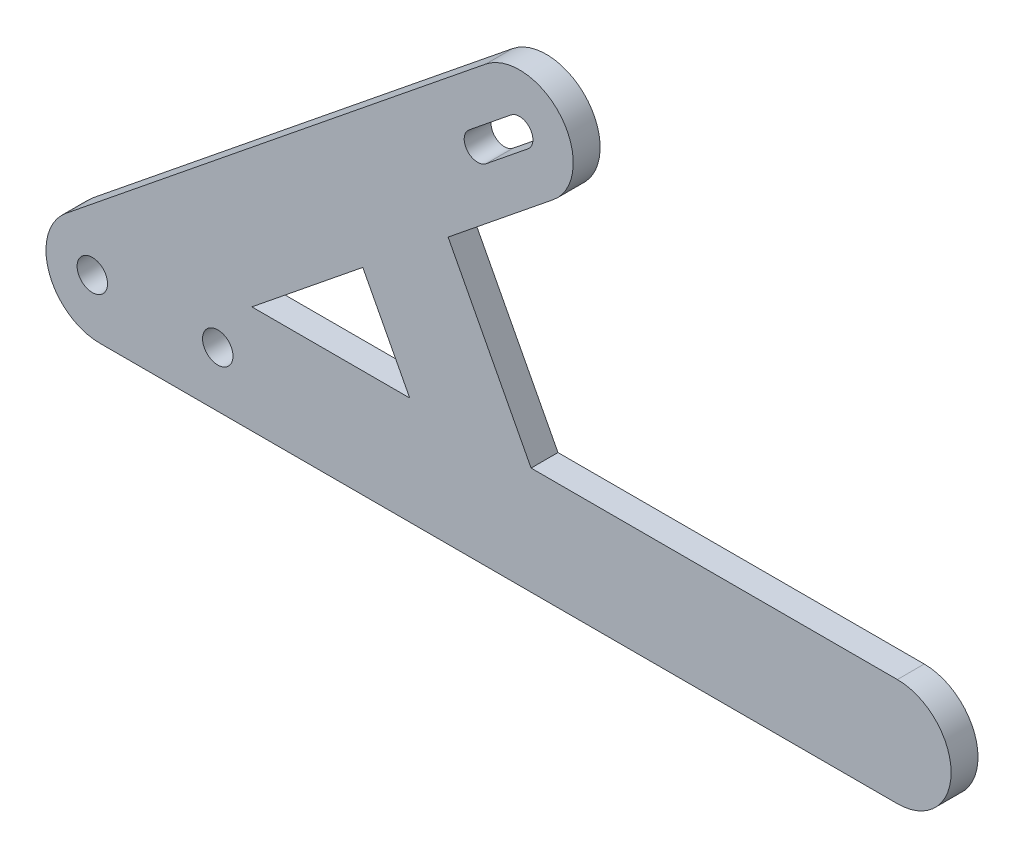
ISO-10303-21;
HEADER;
FILE_DESCRIPTION(('STEP AP214'),'2;1');
FILE_NAME('part.step','',(''),(''),'','','');
FILE_SCHEMA(('AUTOMOTIVE_DESIGN { 1 0 10303 214 1 1 1 1 }'));
ENDSEC;
DATA;
#1=APPLICATION_CONTEXT('core data for automotive mechanical design processes');
#2=APPLICATION_PROTOCOL_DEFINITION('international standard','automotive_design',2000,#1);
#3=PRODUCT_CONTEXT('',#1,'mechanical');
#4=PRODUCT('Part','Part','',(#3));
#5=PRODUCT_RELATED_PRODUCT_CATEGORY('part','',(#4));
#6=PRODUCT_DEFINITION_FORMATION('','',#4);
#7=PRODUCT_DEFINITION_CONTEXT('part definition',#1,'design');
#8=PRODUCT_DEFINITION('design','',#6,#7);
#9=PRODUCT_DEFINITION_SHAPE('','',#8);
#10=(LENGTH_UNIT() NAMED_UNIT(*) SI_UNIT(.MILLI.,.METRE.));
#11=(NAMED_UNIT(*) PLANE_ANGLE_UNIT() SI_UNIT($,.RADIAN.));
#12=(NAMED_UNIT(*) SI_UNIT($,.STERADIAN.) SOLID_ANGLE_UNIT());
#13=UNCERTAINTY_MEASURE_WITH_UNIT(LENGTH_MEASURE(1.E-05),#10,'distance_accuracy_value','');
#14=(GEOMETRIC_REPRESENTATION_CONTEXT(3) GLOBAL_UNCERTAINTY_ASSIGNED_CONTEXT((#13)) GLOBAL_UNIT_ASSIGNED_CONTEXT((#10,
#11,#12)) REPRESENTATION_CONTEXT('',''));
#15=CARTESIAN_POINT('',(0.,0.,0.));
#16=DIRECTION('',(0.,0.,1.));
#17=DIRECTION('',(1.,0.,0.));
#18=AXIS2_PLACEMENT_3D('',#15,#16,#17);
#19=CARTESIAN_POINT('',(-60.3098434553915,-20.4864568832613,3.));
#20=DIRECTION('',(-0.628440545433317,0.777857622483366,0.));
#21=DIRECTION('',(-0.777857622483366,-0.628440545433317,0.));
#22=AXIS2_PLACEMENT_3D('',#19,#20,#21);
#23=PLANE('',#22);
#24=DIRECTION('',(0.777857622483366,0.628440545433317,0.));
#25=VECTOR('',#24,1.);
#26=CARTESIAN_POINT('',(-60.3098434553915,-20.4864568832613,0.));
#27=LINE('',#26,#25);
#28=CARTESIAN_POINT('',(-5.62687624401837,23.6925711894018,0.));
#29=VERTEX_POINT('',#28);
#30=CARTESIAN_POINT('',(6.10421614004999,33.170262071746,0.));
#31=VERTEX_POINT('',#30);
#32=EDGE_CURVE('E195',#29,#31,#27,.T.);
#33=ORIENTED_EDGE('',*,*,#32,.T.);
#34=DIRECTION('',(0.,0.,-1.));
#35=VECTOR('',#34,1.);
#36=CARTESIAN_POINT('',(6.10421614004999,33.170262071746,3.));
#37=LINE('',#36,#35);
#38=CARTESIAN_POINT('',(6.10421614004999,33.170262071746,3.));
#39=VERTEX_POINT('',#38);
#40=EDGE_CURVE('E11',#39,#31,#37,.T.);
#41=ORIENTED_EDGE('',*,*,#40,.F.);
#42=DIRECTION('',(0.777857622483366,0.628440545433317,0.));
#43=VECTOR('',#42,1.);
#44=CARTESIAN_POINT('',(-60.3098434553915,-20.4864568832613,3.));
#45=LINE('',#44,#43);
#46=CARTESIAN_POINT('',(-5.62687624401837,23.6925711894018,3.));
#47=VERTEX_POINT('',#46);
#48=EDGE_CURVE('E263',#47,#39,#45,.T.);
#49=ORIENTED_EDGE('',*,*,#48,.F.);
#50=DIRECTION('',(0.,0.,-1.));
#51=VECTOR('',#50,1.);
#52=CARTESIAN_POINT('',(-5.62687624401837,23.6925711894018,3.));
#53=LINE('',#52,#51);
#54=EDGE_CURVE('E213',#47,#29,#53,.T.);
#55=ORIENTED_EDGE('',*,*,#54,.T.);
#56=EDGE_LOOP('',(#33,#41,#49,#55));
#57=FACE_BOUND('',#56,.T.);
#58=ADVANCED_FACE('F31',(#57),#23,.F.);
#59=CARTESIAN_POINT('',(2.3335728674501,37.8374078066462,3.));
#60=DIRECTION('',(0.,0.,-1.));
#61=DIRECTION('',(-1.,0.,0.));
#62=AXIS2_PLACEMENT_3D('',#59,#60,#61);
#63=CYLINDRICAL_SURFACE('',#62,6.);
#64=CARTESIAN_POINT('',(2.3335728674501,37.8374078066462,0.));
#65=DIRECTION('',(0.,0.,1.));
#66=DIRECTION('',(1.,0.,0.));
#67=AXIS2_PLACEMENT_3D('',#64,#65,#66);
#68=CIRCLE('',#67,6.);
#69=CARTESIAN_POINT('',(-1.43707040514982,42.5045535415464,0.));
#70=VERTEX_POINT('',#69);
#71=EDGE_CURVE('E198',#31,#70,#68,.T.);
#72=ORIENTED_EDGE('',*,*,#71,.T.);
#73=DIRECTION('',(0.,0.,-1.));
#74=VECTOR('',#73,1.);
#75=CARTESIAN_POINT('',(-1.43707040514982,42.5045535415464,3.));
#76=LINE('',#75,#74);
#77=CARTESIAN_POINT('',(-1.43707040514982,42.5045535415464,3.));
#78=VERTEX_POINT('',#77);
#79=EDGE_CURVE('E41',#78,#70,#76,.T.);
#80=ORIENTED_EDGE('',*,*,#79,.F.);
#81=CARTESIAN_POINT('',(2.3335728674501,37.8374078066462,3.));
#82=DIRECTION('',(0.,0.,1.));
#83=DIRECTION('',(1.,0.,0.));
#84=AXIS2_PLACEMENT_3D('',#81,#82,#83);
#85=CIRCLE('',#84,6.);
#86=EDGE_CURVE('E265',#39,#78,#85,.T.);
#87=ORIENTED_EDGE('',*,*,#86,.F.);
#88=ORIENTED_EDGE('',*,*,#40,.T.);
#89=EDGE_LOOP('',(#72,#80,#87,#88));
#90=FACE_BOUND('',#89,.T.);
#91=ADVANCED_FACE('F303',(#90),#63,.T.);
#92=CARTESIAN_POINT('',(-67.8511300005913,-11.1521654134609,3.));
#93=DIRECTION('',(-0.628440545433317,0.777857622483366,0.));
#94=DIRECTION('',(-0.777857622483366,-0.628440545433317,0.));
#95=AXIS2_PLACEMENT_3D('',#92,#93,#94);
#96=PLANE('',#95);
#97=DIRECTION('',(0.777857622483366,0.628440545433317,0.));
#98=VECTOR('',#97,1.);
#99=CARTESIAN_POINT('',(-67.8511300005913,-11.1521654134609,0.));
#100=LINE('',#99,#98);
#101=CARTESIAN_POINT('',(-48.2706432725999,4.66714573490019,0.));
#102=VERTEX_POINT('',#101);
#103=EDGE_CURVE('E201',#102,#70,#100,.T.);
#104=ORIENTED_EDGE('',*,*,#103,.F.);
#105=DIRECTION('',(0.,0.,-1.));
#106=VECTOR('',#105,1.);
#107=CARTESIAN_POINT('',(-48.2706432725999,4.66714573490019,3.));
#108=LINE('',#107,#106);
#109=CARTESIAN_POINT('',(-48.2706432725999,4.66714573490019,3.));
#110=VERTEX_POINT('',#109);
#111=EDGE_CURVE('E221',#110,#102,#108,.T.);
#112=ORIENTED_EDGE('',*,*,#111,.F.);
#113=DIRECTION('',(0.777857622483366,0.628440545433317,0.));
#114=VECTOR('',#113,1.);
#115=CARTESIAN_POINT('',(-67.8511300005913,-11.1521654134609,3.));
#116=LINE('',#115,#114);
#117=EDGE_CURVE('E267',#110,#78,#116,.T.);
#118=ORIENTED_EDGE('',*,*,#117,.T.);
#119=ORIENTED_EDGE('',*,*,#79,.T.);
#120=EDGE_LOOP('',(#104,#112,#118,#119));
#121=FACE_BOUND('',#120,.T.);
#122=ADVANCED_FACE('F308',(#121),#96,.T.);
#123=CARTESIAN_POINT('',(-44.5,0.,3.));
#124=DIRECTION('',(0.,0.,-1.));
#125=DIRECTION('',(-1.,0.,0.));
#126=AXIS2_PLACEMENT_3D('',#123,#124,#125);
#127=CYLINDRICAL_SURFACE('',#126,6.);
#128=CARTESIAN_POINT('',(-44.5,0.,0.));
#129=DIRECTION('',(0.,0.,1.));
#130=DIRECTION('',(1.,0.,0.));
#131=AXIS2_PLACEMENT_3D('',#128,#129,#130);
#132=CIRCLE('',#131,6.);
#133=CARTESIAN_POINT('',(-44.5,-6.00000000000001,0.));
#134=VERTEX_POINT('',#133);
#135=EDGE_CURVE('E204',#102,#134,#132,.T.);
#136=ORIENTED_EDGE('',*,*,#135,.T.);
#137=DIRECTION('',(0.,0.,-1.));
#138=VECTOR('',#137,1.);
#139=CARTESIAN_POINT('',(-44.5,-6.00000000000001,3.));
#140=LINE('',#139,#138);
#141=CARTESIAN_POINT('',(-44.5,-6.00000000000001,3.));
#142=VERTEX_POINT('',#141);
#143=EDGE_CURVE('E218',#142,#134,#140,.T.);
#144=ORIENTED_EDGE('',*,*,#143,.F.);
#145=CARTESIAN_POINT('',(-44.5,0.,3.));
#146=DIRECTION('',(0.,0.,1.));
#147=DIRECTION('',(1.,0.,0.));
#148=AXIS2_PLACEMENT_3D('',#145,#146,#147);
#149=CIRCLE('',#148,6.);
#150=EDGE_CURVE('E270',#110,#142,#149,.T.);
#151=ORIENTED_EDGE('',*,*,#150,.F.);
#152=ORIENTED_EDGE('',*,*,#111,.T.);
#153=EDGE_LOOP('',(#136,#144,#151,#152));
#154=FACE_BOUND('',#153,.T.);
#155=ADVANCED_FACE('F275',(#154),#127,.T.);
#156=CARTESIAN_POINT('',(-4.93689862327537,-6.00000000000001,3.));
#157=DIRECTION('',(0.,1.,0.));
#158=DIRECTION('',(0.,0.,1.));
#159=AXIS2_PLACEMENT_3D('',#156,#157,#158);
#160=PLANE('',#159);
#161=DIRECTION('',(1.,0.,0.));
#162=VECTOR('',#161,1.);
#163=CARTESIAN_POINT('',(-4.93689862327537,-6.00000000000001,0.));
#164=LINE('',#163,#162);
#165=CARTESIAN_POINT('',(44.5,-6.00000000000001,0.));
#166=VERTEX_POINT('',#165);
#167=EDGE_CURVE('E206',#134,#166,#164,.T.);
#168=ORIENTED_EDGE('',*,*,#167,.T.);
#169=DIRECTION('',(0.,0.,-1.));
#170=VECTOR('',#169,1.);
#171=CARTESIAN_POINT('',(44.5,-6.00000000000001,3.));
#172=LINE('',#171,#170);
#173=CARTESIAN_POINT('',(44.5,-6.00000000000001,3.));
#174=VERTEX_POINT('',#173);
#175=EDGE_CURVE('E165',#174,#166,#172,.T.);
#176=ORIENTED_EDGE('',*,*,#175,.F.);
#177=DIRECTION('',(1.,0.,0.));
#178=VECTOR('',#177,1.);
#179=CARTESIAN_POINT('',(-4.93689862327537,-6.00000000000001,3.));
#180=LINE('',#179,#178);
#181=EDGE_CURVE('E152',#142,#174,#180,.T.);
#182=ORIENTED_EDGE('',*,*,#181,.F.);
#183=ORIENTED_EDGE('',*,*,#143,.T.);
#184=EDGE_LOOP('',(#168,#176,#182,#183));
#185=FACE_BOUND('',#184,.T.);
#186=ADVANCED_FACE('F279',(#185),#160,.F.);
#187=CARTESIAN_POINT('',(44.5,0.,3.));
#188=DIRECTION('',(0.,0.,-1.));
#189=DIRECTION('',(-1.,0.,0.));
#190=AXIS2_PLACEMENT_3D('',#187,#188,#189);
#191=CYLINDRICAL_SURFACE('',#190,6.);
#192=CARTESIAN_POINT('',(44.5,0.,0.));
#193=DIRECTION('',(0.,0.,1.));
#194=DIRECTION('',(1.,0.,0.));
#195=AXIS2_PLACEMENT_3D('',#192,#193,#194);
#196=CIRCLE('',#195,6.);
#197=CARTESIAN_POINT('',(44.5,6.00000000000001,0.));
#198=VERTEX_POINT('',#197);
#199=EDGE_CURVE('E161',#166,#198,#196,.T.);
#200=ORIENTED_EDGE('',*,*,#199,.T.);
#201=DIRECTION('',(0.,0.,-1.));
#202=VECTOR('',#201,1.);
#203=CARTESIAN_POINT('',(44.5,6.00000000000001,3.));
#204=LINE('',#203,#202);
#205=CARTESIAN_POINT('',(44.5,6.00000000000001,3.));
#206=VERTEX_POINT('',#205);
#207=EDGE_CURVE('E158',#206,#198,#204,.T.);
#208=ORIENTED_EDGE('',*,*,#207,.F.);
#209=CARTESIAN_POINT('',(44.5,0.,3.));
#210=DIRECTION('',(0.,0.,1.));
#211=DIRECTION('',(1.,0.,0.));
#212=AXIS2_PLACEMENT_3D('',#209,#210,#211);
#213=CIRCLE('',#212,6.);
#214=EDGE_CURVE('E146',#174,#206,#213,.T.);
#215=ORIENTED_EDGE('',*,*,#214,.F.);
#216=ORIENTED_EDGE('',*,*,#175,.T.);
#217=EDGE_LOOP('',(#200,#208,#215,#216));
#218=FACE_BOUND('',#217,.T.);
#219=ADVANCED_FACE('F159',(#218),#191,.T.);
#220=CARTESIAN_POINT('',(-4.93689862327537,6.00000000000001,3.));
#221=DIRECTION('',(0.,1.,0.));
#222=DIRECTION('',(0.,0.,1.));
#223=AXIS2_PLACEMENT_3D('',#220,#221,#222);
#224=PLANE('',#223);
#225=DIRECTION('',(1.,0.,0.));
#226=VECTOR('',#225,1.);
#227=CARTESIAN_POINT('',(-4.93689862327537,6.00000000000001,0.));
#228=LINE('',#227,#226);
#229=CARTESIAN_POINT('',(3.63201233146094,6.00000000000002,0.));
#230=VERTEX_POINT('',#229);
#231=EDGE_CURVE('E209',#230,#198,#228,.T.);
#232=ORIENTED_EDGE('',*,*,#231,.F.);
#233=DIRECTION('',(0.,0.,-1.));
#234=VECTOR('',#233,1.);
#235=CARTESIAN_POINT('',(3.63201233146094,6.00000000000002,3.));
#236=LINE('',#235,#234);
#237=CARTESIAN_POINT('',(3.63201233146094,6.00000000000002,3.));
#238=VERTEX_POINT('',#237);
#239=EDGE_CURVE('E99',#238,#230,#236,.T.);
#240=ORIENTED_EDGE('',*,*,#239,.F.);
#241=DIRECTION('',(1.,0.,0.));
#242=VECTOR('',#241,1.);
#243=CARTESIAN_POINT('',(-4.93689862327537,6.00000000000001,3.));
#244=LINE('',#243,#242);
#245=EDGE_CURVE('E150',#238,#206,#244,.T.);
#246=ORIENTED_EDGE('',*,*,#245,.T.);
#247=ORIENTED_EDGE('',*,*,#207,.T.);
#248=EDGE_LOOP('',(#232,#240,#246,#247));
#249=FACE_BOUND('',#248,.T.);
#250=ADVANCED_FACE('F167',(#249),#224,.T.);
#251=CARTESIAN_POINT('',(-2.33357286745009,34.0667645340463,3.));
#252=DIRECTION('',(0.,0.,-1.));
#253=DIRECTION('',(-1.,0.,0.));
#254=AXIS2_PLACEMENT_3D('',#251,#252,#253);
#255=CYLINDRICAL_SURFACE('',#254,1.5);
#256=CARTESIAN_POINT('',(-2.33357286745009,34.0667645340463,0.));
#257=DIRECTION('',(0.,0.,1.));
#258=DIRECTION('',(1.,0.,0.));
#259=AXIS2_PLACEMENT_3D('',#256,#257,#258);
#260=CIRCLE('',#259,1.5);
#261=CARTESIAN_POINT('',(-3.27623368560007,35.2335509677713,0.));
#262=VERTEX_POINT('',#261);
#263=CARTESIAN_POINT('',(-1.39091204930011,32.8999781003212,0.));
#264=VERTEX_POINT('',#263);
#265=EDGE_CURVE('E183',#262,#264,#260,.T.);
#266=ORIENTED_EDGE('',*,*,#265,.F.);
#267=DIRECTION('',(0.,0.,-1.));
#268=VECTOR('',#267,1.);
#269=CARTESIAN_POINT('',(-3.27623368560007,35.2335509677713,3.));
#270=LINE('',#269,#268);
#271=CARTESIAN_POINT('',(-3.27623368560007,35.2335509677713,3.));
#272=VERTEX_POINT('',#271);
#273=EDGE_CURVE('E215',#272,#262,#270,.T.);
#274=ORIENTED_EDGE('',*,*,#273,.F.);
#275=CARTESIAN_POINT('',(-2.33357286745009,34.0667645340463,3.));
#276=DIRECTION('',(0.,0.,1.));
#277=DIRECTION('',(1.,0.,0.));
#278=AXIS2_PLACEMENT_3D('',#275,#276,#277);
#279=CIRCLE('',#278,1.5);
#280=CARTESIAN_POINT('',(-1.39091204930011,32.8999781003212,3.));
#281=VERTEX_POINT('',#280);
#282=EDGE_CURVE('E252',#272,#281,#279,.T.);
#283=ORIENTED_EDGE('',*,*,#282,.T.);
#284=DIRECTION('',(0.,0.,-1.));
#285=VECTOR('',#284,1.);
#286=CARTESIAN_POINT('',(-1.39091204930011,32.8999781003212,3.));
#287=LINE('',#286,#285);
#288=EDGE_CURVE('E224',#281,#264,#287,.T.);
#289=ORIENTED_EDGE('',*,*,#288,.T.);
#290=EDGE_LOOP('',(#266,#274,#283,#289));
#291=FACE_BOUND('',#290,.T.);
#292=ADVANCED_FACE('F324',(#291),#255,.F.);
#293=CARTESIAN_POINT('',(-65.0231475461414,-14.6525247146361,3.));
#294=DIRECTION('',(0.628440545433318,-0.777857622483366,0.));
#295=DIRECTION('',(0.777857622483366,0.628440545433318,0.));
#296=AXIS2_PLACEMENT_3D('',#293,#294,#295);
#297=PLANE('',#296);
#298=DIRECTION('',(-0.777857622483366,-0.628440545433318,0.));
#299=VECTOR('',#298,1.);
#300=CARTESIAN_POINT('',(-65.0231475461414,-14.6525247146361,0.));
#301=LINE('',#300,#299);
#302=CARTESIAN_POINT('',(1.39091204930011,39.0041942403712,0.));
#303=VERTEX_POINT('',#302);
#304=EDGE_CURVE('E186',#303,#262,#301,.T.);
#305=ORIENTED_EDGE('',*,*,#304,.F.);
#306=DIRECTION('',(0.,0.,-1.));
#307=VECTOR('',#306,1.);
#308=CARTESIAN_POINT('',(1.39091204930011,39.0041942403712,3.));
#309=LINE('',#308,#307);
#310=CARTESIAN_POINT('',(1.39091204930011,39.0041942403712,3.));
#311=VERTEX_POINT('',#310);
#312=EDGE_CURVE('E228',#311,#303,#309,.T.);
#313=ORIENTED_EDGE('',*,*,#312,.F.);
#314=DIRECTION('',(-0.777857622483366,-0.628440545433318,0.));
#315=VECTOR('',#314,1.);
#316=CARTESIAN_POINT('',(-65.0231475461414,-14.6525247146361,3.));
#317=LINE('',#316,#315);
#318=EDGE_CURVE('E255',#311,#272,#317,.T.);
#319=ORIENTED_EDGE('',*,*,#318,.T.);
#320=ORIENTED_EDGE('',*,*,#273,.T.);
#321=EDGE_LOOP('',(#305,#313,#319,#320));
#322=FACE_BOUND('',#321,.T.);
#323=ADVANCED_FACE('F320',(#322),#297,.T.);
#324=CARTESIAN_POINT('',(2.3335728674501,37.8374078066462,3.));
#325=DIRECTION('',(0.,0.,-1.));
#326=DIRECTION('',(-1.,0.,0.));
#327=AXIS2_PLACEMENT_3D('',#324,#325,#326);
#328=CYLINDRICAL_SURFACE('',#327,1.5);
#329=CARTESIAN_POINT('',(2.3335728674501,37.8374078066462,0.));
#330=DIRECTION('',(0.,0.,1.));
#331=DIRECTION('',(1.,0.,0.));
#332=AXIS2_PLACEMENT_3D('',#329,#330,#331);
#333=CIRCLE('',#332,1.5);
#334=CARTESIAN_POINT('',(3.27623368560008,36.6706213729211,0.));
#335=VERTEX_POINT('',#334);
#336=EDGE_CURVE('E189',#335,#303,#333,.T.);
#337=ORIENTED_EDGE('',*,*,#336,.F.);
#338=DIRECTION('',(0.,0.,-1.));
#339=VECTOR('',#338,1.);
#340=CARTESIAN_POINT('',(3.27623368560008,36.6706213729211,3.));
#341=LINE('',#340,#339);
#342=CARTESIAN_POINT('',(3.27623368560008,36.6706213729211,3.));
#343=VERTEX_POINT('',#342);
#344=EDGE_CURVE('E226',#343,#335,#341,.T.);
#345=ORIENTED_EDGE('',*,*,#344,.F.);
#346=CARTESIAN_POINT('',(2.3335728674501,37.8374078066462,3.));
#347=DIRECTION('',(0.,0.,1.));
#348=DIRECTION('',(1.,0.,0.));
#349=AXIS2_PLACEMENT_3D('',#346,#347,#348);
#350=CIRCLE('',#349,1.5);
#351=EDGE_CURVE('E258',#343,#311,#350,.T.);
#352=ORIENTED_EDGE('',*,*,#351,.T.);
#353=ORIENTED_EDGE('',*,*,#312,.T.);
#354=EDGE_LOOP('',(#337,#345,#352,#353));
#355=FACE_BOUND('',#354,.T.);
#356=ADVANCED_FACE('F317',(#355),#328,.F.);
#357=CARTESIAN_POINT('',(30.1951542421138,-70.6394594620922,3.));
#358=DIRECTION('',(-0.886009492476729,-0.463667099588842,0.));
#359=DIRECTION('',(0.463667099588842,-0.886009492476729,0.));
#360=AXIS2_PLACEMENT_3D('',#357,#358,#359);
#361=PLANE('',#360);
#362=DIRECTION('',(-0.463667099588842,0.886009492476729,0.));
#363=VECTOR('',#362,1.);
#364=CARTESIAN_POINT('',(30.1951542421138,-70.6394594620922,0.));
#365=LINE('',#364,#363);
#366=CARTESIAN_POINT('',(-9.91186062012051,6.00000000000001,0.));
#367=VERTEX_POINT('',#366);
#368=CARTESIAN_POINT('',(-15.1460642107307,16.0019045365711,0.));
#369=VERTEX_POINT('',#368);
#370=EDGE_CURVE('E173',#367,#369,#365,.T.);
#371=ORIENTED_EDGE('',*,*,#370,.F.);
#372=DIRECTION('',(0.,0.,-1.));
#373=VECTOR('',#372,1.);
#374=CARTESIAN_POINT('',(-9.91186062012051,6.00000000000001,3.));
#375=LINE('',#374,#373);
#376=CARTESIAN_POINT('',(-9.91186062012051,6.00000000000001,3.));
#377=VERTEX_POINT('',#376);
#378=EDGE_CURVE('E110',#377,#367,#375,.T.);
#379=ORIENTED_EDGE('',*,*,#378,.F.);
#380=DIRECTION('',(-0.463667099588842,0.886009492476729,0.));
#381=VECTOR('',#380,1.);
#382=CARTESIAN_POINT('',(30.1951542421138,-70.6394594620922,3.));
#383=LINE('',#382,#381);
#384=CARTESIAN_POINT('',(-15.1460642107307,16.0019045365711,3.));
#385=VERTEX_POINT('',#384);
#386=EDGE_CURVE('E212',#377,#385,#383,.T.);
#387=ORIENTED_EDGE('',*,*,#386,.T.);
#388=DIRECTION('',(0.,0.,-1.));
#389=VECTOR('',#388,1.);
#390=CARTESIAN_POINT('',(-15.1460642107307,16.0019045365711,3.));
#391=LINE('',#390,#389);
#392=EDGE_CURVE('E169',#385,#369,#391,.T.);
#393=ORIENTED_EDGE('',*,*,#392,.T.);
#394=EDGE_LOOP('',(#371,#379,#387,#393));
#395=FACE_BOUND('',#394,.T.);
#396=ADVANCED_FACE('F33',(#395),#361,.T.);
#397=CARTESIAN_POINT('',(-4.93689862327537,6.00000000000001,3.));
#398=DIRECTION('',(0.,1.,0.));
#399=DIRECTION('',(0.,0.,1.));
#400=AXIS2_PLACEMENT_3D('',#397,#398,#399);
#401=PLANE('',#400);
#402=DIRECTION('',(1.,0.,0.));
#403=VECTOR('',#402,1.);
#404=CARTESIAN_POINT('',(-4.93689862327537,6.00000000000001,0.));
#405=LINE('',#404,#403);
#406=CARTESIAN_POINT('',(-27.526006497488,6.00000000000001,0.));
#407=VERTEX_POINT('',#406);
#408=EDGE_CURVE('E176',#407,#367,#405,.T.);
#409=ORIENTED_EDGE('',*,*,#408,.F.);
#410=DIRECTION('',(0.,0.,-1.));
#411=VECTOR('',#410,1.);
#412=CARTESIAN_POINT('',(-27.526006497488,6.00000000000001,3.));
#413=LINE('',#412,#411);
#414=CARTESIAN_POINT('',(-27.526006497488,6.00000000000001,3.));
#415=VERTEX_POINT('',#414);
#416=EDGE_CURVE('E232',#415,#407,#413,.T.);
#417=ORIENTED_EDGE('',*,*,#416,.F.);
#418=DIRECTION('',(1.,0.,0.));
#419=VECTOR('',#418,1.);
#420=CARTESIAN_POINT('',(-4.93689862327537,6.00000000000001,3.));
#421=LINE('',#420,#419);
#422=EDGE_CURVE('E247',#415,#377,#421,.T.);
#423=ORIENTED_EDGE('',*,*,#422,.T.);
#424=ORIENTED_EDGE('',*,*,#378,.T.);
#425=EDGE_LOOP('',(#409,#417,#423,#424));
#426=FACE_BOUND('',#425,.T.);
#427=ADVANCED_FACE('F315',(#426),#401,.T.);
#428=CARTESIAN_POINT('',(-63.1378259098414,-16.9860975820862,3.));
#429=DIRECTION('',(0.628440545433317,-0.777857622483366,0.));
#430=DIRECTION('',(0.777857622483366,0.628440545433317,0.));
#431=AXIS2_PLACEMENT_3D('',#428,#429,#430);
#432=PLANE('',#431);
#433=DIRECTION('',(-0.777857622483366,-0.628440545433317,0.));
#434=VECTOR('',#433,1.);
#435=CARTESIAN_POINT('',(-63.1378259098414,-16.9860975820862,0.));
#436=LINE('',#435,#434);
#437=EDGE_CURVE('E192',#335,#264,#436,.T.);
#438=ORIENTED_EDGE('',*,*,#437,.T.);
#439=ORIENTED_EDGE('',*,*,#288,.F.);
#440=DIRECTION('',(-0.777857622483366,-0.628440545433317,0.));
#441=VECTOR('',#440,1.);
#442=CARTESIAN_POINT('',(-63.1378259098414,-16.9860975820862,3.));
#443=LINE('',#442,#441);
#444=EDGE_CURVE('E261',#343,#281,#443,.T.);
#445=ORIENTED_EDGE('',*,*,#444,.F.);
#446=ORIENTED_EDGE('',*,*,#344,.T.);
#447=EDGE_LOOP('',(#438,#439,#445,#446));
#448=FACE_BOUND('',#447,.T.);
#449=ADVANCED_FACE('F297',(#448),#432,.F.);
#450=CARTESIAN_POINT('',(-60.3098434553916,-20.4864568832613,3.));
#451=DIRECTION('',(-0.628440545433318,0.777857622483366,0.));
#452=DIRECTION('',(-0.777857622483366,-0.628440545433318,0.));
#453=AXIS2_PLACEMENT_3D('',#450,#451,#452);
#454=PLANE('',#453);
#455=DIRECTION('',(0.777857622483366,0.628440545433318,0.));
#456=VECTOR('',#455,1.);
#457=CARTESIAN_POINT('',(-60.3098434553916,-20.4864568832613,0.));
#458=LINE('',#457,#456);
#459=EDGE_CURVE('E180',#407,#369,#458,.T.);
#460=ORIENTED_EDGE('',*,*,#459,.T.);
#461=ORIENTED_EDGE('',*,*,#392,.F.);
#462=DIRECTION('',(0.777857622483366,0.628440545433318,0.));
#463=VECTOR('',#462,1.);
#464=CARTESIAN_POINT('',(-60.3098434553916,-20.4864568832613,3.));
#465=LINE('',#464,#463);
#466=EDGE_CURVE('E250',#415,#385,#465,.T.);
#467=ORIENTED_EDGE('',*,*,#466,.F.);
#468=ORIENTED_EDGE('',*,*,#416,.T.);
#469=EDGE_LOOP('',(#460,#461,#467,#468));
#470=FACE_BOUND('',#469,.T.);
#471=ADVANCED_FACE('F288',(#470),#454,.F.);
#472=CARTESIAN_POINT('',(40.8272681518346,-65.0754542670261,3.));
#473=DIRECTION('',(-0.886009492476729,-0.463667099588842,0.));
#474=DIRECTION('',(0.463667099588842,-0.886009492476729,0.));
#475=AXIS2_PLACEMENT_3D('',#472,#473,#474);
#476=PLANE('',#475);
#477=DIRECTION('',(-0.463667099588842,0.886009492476729,0.));
#478=VECTOR('',#477,1.);
#479=CARTESIAN_POINT('',(40.8272681518346,-65.0754542670261,0.));
#480=LINE('',#479,#478);
#481=EDGE_CURVE('E102',#230,#29,#480,.T.);
#482=ORIENTED_EDGE('',*,*,#481,.T.);
#483=ORIENTED_EDGE('',*,*,#54,.F.);
#484=DIRECTION('',(-0.463667099588842,0.886009492476729,0.));
#485=VECTOR('',#484,1.);
#486=CARTESIAN_POINT('',(40.8272681518346,-65.0754542670261,3.));
#487=LINE('',#486,#485);
#488=EDGE_CURVE('E50',#238,#47,#487,.T.);
#489=ORIENTED_EDGE('',*,*,#488,.F.);
#490=ORIENTED_EDGE('',*,*,#239,.T.);
#491=EDGE_LOOP('',(#482,#483,#489,#490));
#492=FACE_BOUND('',#491,.T.);
#493=ADVANCED_FACE('F286',(#492),#476,.F.);
#494=CARTESIAN_POINT('',(-4.93689862327537,-89.0247896340764,3.));
#495=DIRECTION('',(0.,0.,1.));
#496=DIRECTION('',(1.,0.,0.));
#497=AXIS2_PLACEMENT_3D('',#494,#495,#496);
#498=PLANE('',#497);
#499=CARTESIAN_POINT('',(-45.3291541617197,0.177691476946059,3.));
#500=DIRECTION('',(0.,0.,1.));
#501=DIRECTION('',(1.,0.,0.));
#502=AXIS2_PLACEMENT_3D('',#499,#500,#501);
#503=CIRCLE('',#502,1.7);
#504=CARTESIAN_POINT('',(-43.6291541617197,0.177691476946059,3.));
#505=VERTEX_POINT('',#504);
#506=EDGE_CURVE('E243',#505,#505,#503,.T.);
#507=ORIENTED_EDGE('',*,*,#506,.F.);
#508=EDGE_LOOP('',(#507));
#509=FACE_BOUND('',#508,.T.);
#510=CARTESIAN_POINT('',(-31.3291541617197,0.177691476946057,3.));
#511=DIRECTION('',(0.,0.,1.));
#512=DIRECTION('',(1.,0.,0.));
#513=AXIS2_PLACEMENT_3D('',#510,#511,#512);
#514=CIRCLE('',#513,1.7);
#515=CARTESIAN_POINT('',(-29.6291541617197,0.177691476946057,3.));
#516=VERTEX_POINT('',#515);
#517=EDGE_CURVE('E235',#516,#516,#514,.T.);
#518=ORIENTED_EDGE('',*,*,#517,.F.);
#519=EDGE_LOOP('',(#518));
#520=FACE_BOUND('',#519,.T.);
#521=ORIENTED_EDGE('',*,*,#386,.F.);
#522=ORIENTED_EDGE('',*,*,#422,.F.);
#523=ORIENTED_EDGE('',*,*,#466,.T.);
#524=EDGE_LOOP('',(#521,#522,#523));
#525=FACE_BOUND('',#524,.T.);
#526=ORIENTED_EDGE('',*,*,#282,.F.);
#527=ORIENTED_EDGE('',*,*,#318,.F.);
#528=ORIENTED_EDGE('',*,*,#351,.F.);
#529=ORIENTED_EDGE('',*,*,#444,.T.);
#530=EDGE_LOOP('',(#526,#527,#528,#529));
#531=FACE_BOUND('',#530,.T.);
#532=ORIENTED_EDGE('',*,*,#48,.T.);
#533=ORIENTED_EDGE('',*,*,#86,.T.);
#534=ORIENTED_EDGE('',*,*,#117,.F.);
#535=ORIENTED_EDGE('',*,*,#150,.T.);
#536=ORIENTED_EDGE('',*,*,#181,.T.);
#537=ORIENTED_EDGE('',*,*,#214,.T.);
#538=ORIENTED_EDGE('',*,*,#245,.F.);
#539=ORIENTED_EDGE('',*,*,#488,.T.);
#540=EDGE_LOOP('',(#532,#533,#534,#535,#536,#537,#538,#539));
#541=FACE_BOUND('',#540,.T.);
#542=ADVANCED_FACE('F148',(#509,#520,#525,#531,#541),#498,.T.);
#543=CARTESIAN_POINT('',(-4.93689862327537,-89.0247896340764,0.));
#544=DIRECTION('',(0.,0.,1.));
#545=DIRECTION('',(1.,0.,0.));
#546=AXIS2_PLACEMENT_3D('',#543,#544,#545);
#547=PLANE('',#546);
#548=CARTESIAN_POINT('',(-45.3291541617197,0.177691476946059,0.));
#549=DIRECTION('',(0.,0.,1.));
#550=DIRECTION('',(1.,0.,0.));
#551=AXIS2_PLACEMENT_3D('',#548,#549,#550);
#552=CIRCLE('',#551,1.7);
#553=CARTESIAN_POINT('',(-43.6291541617197,0.177691476946059,0.));
#554=VERTEX_POINT('',#553);
#555=EDGE_CURVE('E35',#554,#554,#552,.T.);
#556=ORIENTED_EDGE('',*,*,#555,.T.);
#557=EDGE_LOOP('',(#556));
#558=FACE_BOUND('',#557,.T.);
#559=CARTESIAN_POINT('',(-31.3291541617197,0.177691476946057,0.));
#560=DIRECTION('',(0.,0.,1.));
#561=DIRECTION('',(1.,0.,0.));
#562=AXIS2_PLACEMENT_3D('',#559,#560,#561);
#563=CIRCLE('',#562,1.7);
#564=CARTESIAN_POINT('',(-29.6291541617197,0.177691476946057,0.));
#565=VERTEX_POINT('',#564);
#566=EDGE_CURVE('E177',#565,#565,#563,.T.);
#567=ORIENTED_EDGE('',*,*,#566,.T.);
#568=EDGE_LOOP('',(#567));
#569=FACE_BOUND('',#568,.T.);
#570=ORIENTED_EDGE('',*,*,#370,.T.);
#571=ORIENTED_EDGE('',*,*,#459,.F.);
#572=ORIENTED_EDGE('',*,*,#408,.T.);
#573=EDGE_LOOP('',(#570,#571,#572));
#574=FACE_BOUND('',#573,.T.);
#575=ORIENTED_EDGE('',*,*,#265,.T.);
#576=ORIENTED_EDGE('',*,*,#437,.F.);
#577=ORIENTED_EDGE('',*,*,#336,.T.);
#578=ORIENTED_EDGE('',*,*,#304,.T.);
#579=EDGE_LOOP('',(#575,#576,#577,#578));
#580=FACE_BOUND('',#579,.T.);
#581=ORIENTED_EDGE('',*,*,#32,.F.);
#582=ORIENTED_EDGE('',*,*,#481,.F.);
#583=ORIENTED_EDGE('',*,*,#231,.T.);
#584=ORIENTED_EDGE('',*,*,#199,.F.);
#585=ORIENTED_EDGE('',*,*,#167,.F.);
#586=ORIENTED_EDGE('',*,*,#135,.F.);
#587=ORIENTED_EDGE('',*,*,#103,.T.);
#588=ORIENTED_EDGE('',*,*,#71,.F.);
#589=EDGE_LOOP('',(#581,#582,#583,#584,#585,#586,#587,#588));
#590=FACE_BOUND('',#589,.T.);
#591=ADVANCED_FACE('F282',(#558,#569,#574,#580,#590),#547,.F.);
#592=CARTESIAN_POINT('',(-31.3291541617197,0.177691476946057,3.));
#593=DIRECTION('',(0.,0.,1.));
#594=DIRECTION('',(1.,0.,0.));
#595=AXIS2_PLACEMENT_3D('',#592,#593,#594);
#596=CYLINDRICAL_SURFACE('',#595,1.7);
#597=ORIENTED_EDGE('',*,*,#517,.T.);
#598=EDGE_LOOP('',(#597));
#599=FACE_BOUND('',#598,.T.);
#600=ORIENTED_EDGE('',*,*,#566,.F.);
#601=EDGE_LOOP('',(#600));
#602=FACE_BOUND('',#601,.T.);
#603=ADVANCED_FACE('F352',(#599,#602),#596,.F.);
#604=CARTESIAN_POINT('',(-45.3291541617197,0.177691476946059,3.));
#605=DIRECTION('',(0.,0.,1.));
#606=DIRECTION('',(1.,0.,0.));
#607=AXIS2_PLACEMENT_3D('',#604,#605,#606);
#608=CYLINDRICAL_SURFACE('',#607,1.7);
#609=ORIENTED_EDGE('',*,*,#506,.T.);
#610=EDGE_LOOP('',(#609));
#611=FACE_BOUND('',#610,.T.);
#612=ORIENTED_EDGE('',*,*,#555,.F.);
#613=EDGE_LOOP('',(#612));
#614=FACE_BOUND('',#613,.T.);
#615=ADVANCED_FACE('F358',(#611,#614),#608,.F.);
#616=CLOSED_SHELL('',(#58,#91,#122,#155,#186,#219,#250,#292,#323,#356,#396,#427,#449,#471,#493,
#542,#591,#603,#615));
#617=MANIFOLD_SOLID_BREP('B2',#616);
#618=ADVANCED_BREP_SHAPE_REPRESENTATION('',(#18,#617),#14);
#619=SHAPE_DEFINITION_REPRESENTATION(#9,#618);
ENDSEC;
END-ISO-10303-21;
